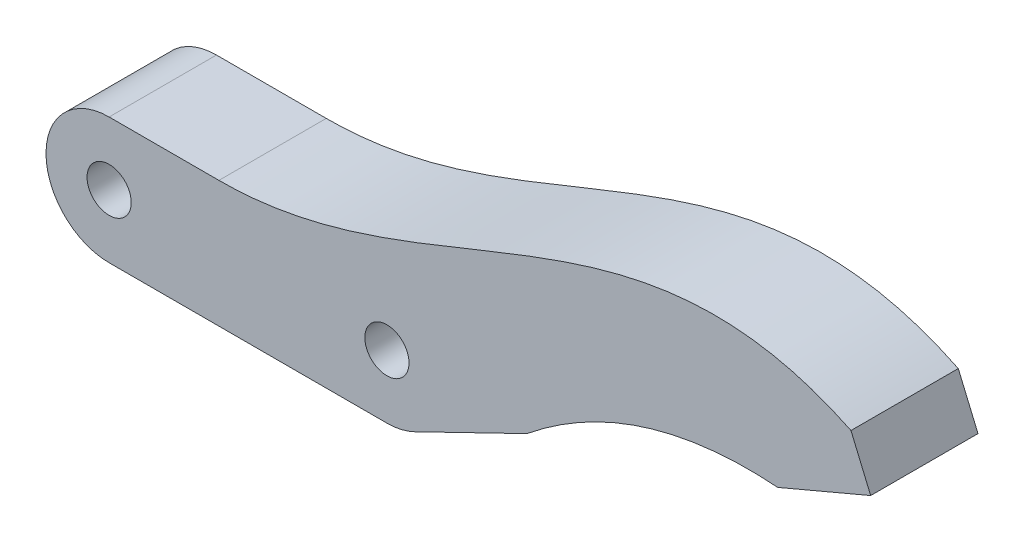
ISO-10303-21;
HEADER;
FILE_DESCRIPTION(('STEP AP214'),'2;1');
FILE_NAME('part.step','',(''),(''),'','','');
FILE_SCHEMA(('AUTOMOTIVE_DESIGN { 1 0 10303 214 1 1 1 1 }'));
ENDSEC;
DATA;
#1=APPLICATION_CONTEXT('core data for automotive mechanical design processes');
#2=APPLICATION_PROTOCOL_DEFINITION('international standard','automotive_design',2000,#1);
#3=PRODUCT_CONTEXT('',#1,'mechanical');
#4=PRODUCT('Part','Part','',(#3));
#5=PRODUCT_RELATED_PRODUCT_CATEGORY('part','',(#4));
#6=PRODUCT_DEFINITION_FORMATION('','',#4);
#7=PRODUCT_DEFINITION_CONTEXT('part definition',#1,'design');
#8=PRODUCT_DEFINITION('design','',#6,#7);
#9=PRODUCT_DEFINITION_SHAPE('','',#8);
#10=(LENGTH_UNIT() NAMED_UNIT(*) SI_UNIT(.MILLI.,.METRE.));
#11=(NAMED_UNIT(*) PLANE_ANGLE_UNIT() SI_UNIT($,.RADIAN.));
#12=(NAMED_UNIT(*) SI_UNIT($,.STERADIAN.) SOLID_ANGLE_UNIT());
#13=UNCERTAINTY_MEASURE_WITH_UNIT(LENGTH_MEASURE(1.E-05),#10,'distance_accuracy_value','');
#14=(GEOMETRIC_REPRESENTATION_CONTEXT(3) GLOBAL_UNCERTAINTY_ASSIGNED_CONTEXT((#13)) GLOBAL_UNIT_ASSIGNED_CONTEXT((#10,
#11,#12)) REPRESENTATION_CONTEXT('',''));
#15=CARTESIAN_POINT('',(0.,0.,0.));
#16=DIRECTION('',(0.,0.,1.));
#17=DIRECTION('',(1.,0.,0.));
#18=AXIS2_PLACEMENT_3D('',#15,#16,#17);
#19=CARTESIAN_POINT('',(27.,5.,4.25));
#20=DIRECTION('',(0.,0.,-1.));
#21=DIRECTION('',(-1.,0.,0.));
#22=AXIS2_PLACEMENT_3D('',#19,#20,#21);
#23=CYLINDRICAL_SURFACE('',#22,5.);
#24=DIRECTION('',(0.,0.,1.));
#25=VECTOR('',#24,1.);
#26=CARTESIAN_POINT('',(29.1838370751845,0.502127655318626,-4.25));
#27=LINE('',#26,#25);
#28=CARTESIAN_POINT('',(29.1838370751845,0.502127655318626,-4.25));
#29=VERTEX_POINT('',#28);
#30=CARTESIAN_POINT('',(29.1838370751845,0.502127655318626,4.25));
#31=VERTEX_POINT('',#30);
#32=EDGE_CURVE('E289',#29,#31,#27,.T.);
#33=ORIENTED_EDGE('',*,*,#32,.T.);
#34=CARTESIAN_POINT('',(27.,5.,4.25));
#35=DIRECTION('',(0.,0.,1.));
#36=DIRECTION('',(1.,0.,0.));
#37=AXIS2_PLACEMENT_3D('',#34,#35,#36);
#38=CIRCLE('',#37,5.);
#39=CARTESIAN_POINT('',(27.,0.,4.25));
#40=VERTEX_POINT('',#39);
#41=EDGE_CURVE('E236',#40,#31,#38,.T.);
#42=ORIENTED_EDGE('',*,*,#41,.F.);
#43=DIRECTION('',(0.,0.,-1.));
#44=VECTOR('',#43,1.);
#45=CARTESIAN_POINT('',(27.,0.,4.25));
#46=LINE('',#45,#44);
#47=CARTESIAN_POINT('',(27.,0.,-4.25));
#48=VERTEX_POINT('',#47);
#49=EDGE_CURVE('E57',#40,#48,#46,.T.);
#50=ORIENTED_EDGE('',*,*,#49,.T.);
#51=CARTESIAN_POINT('',(27.,5.,-4.25));
#52=DIRECTION('',(0.,0.,1.));
#53=DIRECTION('',(1.,0.,0.));
#54=AXIS2_PLACEMENT_3D('',#51,#52,#53);
#55=CIRCLE('',#54,5.);
#56=EDGE_CURVE('E210',#48,#29,#55,.T.);
#57=ORIENTED_EDGE('',*,*,#56,.T.);
#58=EDGE_LOOP('',(#33,#42,#50,#57));
#59=FACE_BOUND('',#58,.T.);
#60=ADVANCED_FACE('F47',(#59),#23,.T.);
#61=CARTESIAN_POINT('',(5.,5.,4.25));
#62=DIRECTION('',(0.,0.,-1.));
#63=DIRECTION('',(-1.,0.,0.));
#64=AXIS2_PLACEMENT_3D('',#61,#62,#63);
#65=CYLINDRICAL_SURFACE('',#64,5.);
#66=CARTESIAN_POINT('',(5.,5.,-4.25));
#67=DIRECTION('',(0.,0.,1.));
#68=DIRECTION('',(1.,0.,0.));
#69=AXIS2_PLACEMENT_3D('',#66,#67,#68);
#70=CIRCLE('',#69,5.);
#71=CARTESIAN_POINT('',(5.,10.,-4.25));
#72=VERTEX_POINT('',#71);
#73=CARTESIAN_POINT('',(5.,0.,-4.25));
#74=VERTEX_POINT('',#73);
#75=EDGE_CURVE('E202',#72,#74,#70,.T.);
#76=ORIENTED_EDGE('',*,*,#75,.T.);
#77=DIRECTION('',(0.,0.,-1.));
#78=VECTOR('',#77,1.);
#79=CARTESIAN_POINT('',(5.,0.,4.25));
#80=LINE('',#79,#78);
#81=CARTESIAN_POINT('',(5.,0.,4.25));
#82=VERTEX_POINT('',#81);
#83=EDGE_CURVE('E11',#82,#74,#80,.T.);
#84=ORIENTED_EDGE('',*,*,#83,.F.);
#85=CARTESIAN_POINT('',(5.,5.,4.25));
#86=DIRECTION('',(0.,0.,1.));
#87=DIRECTION('',(1.,0.,0.));
#88=AXIS2_PLACEMENT_3D('',#85,#86,#87);
#89=CIRCLE('',#88,5.);
#90=CARTESIAN_POINT('',(5.,10.,4.25));
#91=VERTEX_POINT('',#90);
#92=EDGE_CURVE('E297',#91,#82,#89,.T.);
#93=ORIENTED_EDGE('',*,*,#92,.F.);
#94=DIRECTION('',(0.,0.,-1.));
#95=VECTOR('',#94,1.);
#96=CARTESIAN_POINT('',(5.,10.,4.25));
#97=LINE('',#96,#95);
#98=EDGE_CURVE('E65',#91,#72,#97,.T.);
#99=ORIENTED_EDGE('',*,*,#98,.T.);
#100=EDGE_LOOP('',(#76,#84,#93,#99));
#101=FACE_BOUND('',#100,.T.);
#102=ADVANCED_FACE('F196',(#101),#65,.T.);
#103=CARTESIAN_POINT('',(0.,0.,4.25));
#104=DIRECTION('',(0.,1.,0.));
#105=DIRECTION('',(0.,0.,1.));
#106=AXIS2_PLACEMENT_3D('',#103,#104,#105);
#107=PLANE('',#106);
#108=DIRECTION('',(1.,0.,0.));
#109=VECTOR('',#108,1.);
#110=CARTESIAN_POINT('',(0.,0.,-4.25));
#111=LINE('',#110,#109);
#112=EDGE_CURVE('E79',#74,#48,#111,.T.);
#113=ORIENTED_EDGE('',*,*,#112,.T.);
#114=ORIENTED_EDGE('',*,*,#49,.F.);
#115=DIRECTION('',(1.,0.,0.));
#116=VECTOR('',#115,1.);
#117=CARTESIAN_POINT('',(0.,0.,4.25));
#118=LINE('',#117,#116);
#119=EDGE_CURVE('E85',#82,#40,#118,.T.);
#120=ORIENTED_EDGE('',*,*,#119,.F.);
#121=ORIENTED_EDGE('',*,*,#83,.T.);
#122=EDGE_LOOP('',(#113,#114,#120,#121));
#123=FACE_BOUND('',#122,.T.);
#124=ADVANCED_FACE('F193',(#123),#107,.F.);
#125=CARTESIAN_POINT('',(0.,10.,4.25));
#126=DIRECTION('',(0.,1.,0.));
#127=DIRECTION('',(0.,0.,1.));
#128=AXIS2_PLACEMENT_3D('',#125,#126,#127);
#129=PLANE('',#128);
#130=DIRECTION('',(0.,0.,1.));
#131=VECTOR('',#130,1.);
#132=CARTESIAN_POINT('',(13.69497476,10.,-4.25));
#133=LINE('',#132,#131);
#134=CARTESIAN_POINT('',(13.69497476,10.,-4.25));
#135=VERTEX_POINT('',#134);
#136=CARTESIAN_POINT('',(13.69497476,10.,4.25));
#137=VERTEX_POINT('',#136);
#138=EDGE_CURVE('E136',#135,#137,#133,.T.);
#139=ORIENTED_EDGE('',*,*,#138,.F.);
#140=DIRECTION('',(1.,0.,0.));
#141=VECTOR('',#140,1.);
#142=CARTESIAN_POINT('',(0.,10.,-4.25));
#143=LINE('',#142,#141);
#144=EDGE_CURVE('E147',#72,#135,#143,.T.);
#145=ORIENTED_EDGE('',*,*,#144,.F.);
#146=ORIENTED_EDGE('',*,*,#98,.F.);
#147=DIRECTION('',(1.,0.,0.));
#148=VECTOR('',#147,1.);
#149=CARTESIAN_POINT('',(0.,10.,4.25));
#150=LINE('',#149,#148);
#151=EDGE_CURVE('E302',#91,#137,#150,.T.);
#152=ORIENTED_EDGE('',*,*,#151,.T.);
#153=EDGE_LOOP('',(#139,#145,#146,#152));
#154=FACE_BOUND('',#153,.T.);
#155=ADVANCED_FACE('F190',(#154),#129,.T.);
#156=CARTESIAN_POINT('',(5.,5.,4.25));
#157=DIRECTION('',(0.,0.,-1.));
#158=DIRECTION('',(-1.,0.,0.));
#159=AXIS2_PLACEMENT_3D('',#156,#157,#158);
#160=CYLINDRICAL_SURFACE('',#159,1.75);
#161=CARTESIAN_POINT('',(5.,5.,4.25));
#162=DIRECTION('',(0.,0.,1.));
#163=DIRECTION('',(1.,0.,0.));
#164=AXIS2_PLACEMENT_3D('',#161,#162,#163);
#165=CIRCLE('',#164,1.75);
#166=CARTESIAN_POINT('',(6.75,5.,4.25));
#167=VERTEX_POINT('',#166);
#168=EDGE_CURVE('E226',#167,#167,#165,.T.);
#169=ORIENTED_EDGE('',*,*,#168,.T.);
#170=EDGE_LOOP('',(#169));
#171=FACE_BOUND('',#170,.T.);
#172=CARTESIAN_POINT('',(5.,5.,-4.25));
#173=DIRECTION('',(0.,0.,1.));
#174=DIRECTION('',(1.,0.,0.));
#175=AXIS2_PLACEMENT_3D('',#172,#173,#174);
#176=CIRCLE('',#175,1.75);
#177=CARTESIAN_POINT('',(6.75,5.,-4.25));
#178=VERTEX_POINT('',#177);
#179=EDGE_CURVE('E204',#178,#178,#176,.T.);
#180=ORIENTED_EDGE('',*,*,#179,.F.);
#181=EDGE_LOOP('',(#180));
#182=FACE_BOUND('',#181,.T.);
#183=ADVANCED_FACE('F49',(#171,#182),#160,.F.);
#184=CARTESIAN_POINT('',(27.,5.,4.25));
#185=DIRECTION('',(0.,0.,-1.));
#186=DIRECTION('',(-1.,0.,0.));
#187=AXIS2_PLACEMENT_3D('',#184,#185,#186);
#188=CYLINDRICAL_SURFACE('',#187,1.75);
#189=CARTESIAN_POINT('',(27.,5.,4.25));
#190=DIRECTION('',(0.,0.,1.));
#191=DIRECTION('',(1.,0.,0.));
#192=AXIS2_PLACEMENT_3D('',#189,#190,#191);
#193=CIRCLE('',#192,1.75);
#194=CARTESIAN_POINT('',(28.75,5.,4.25));
#195=VERTEX_POINT('',#194);
#196=EDGE_CURVE('E228',#195,#195,#193,.T.);
#197=ORIENTED_EDGE('',*,*,#196,.T.);
#198=EDGE_LOOP('',(#197));
#199=FACE_BOUND('',#198,.T.);
#200=CARTESIAN_POINT('',(27.,5.,-4.25));
#201=DIRECTION('',(0.,0.,1.));
#202=DIRECTION('',(1.,0.,0.));
#203=AXIS2_PLACEMENT_3D('',#200,#201,#202);
#204=CIRCLE('',#203,1.75);
#205=CARTESIAN_POINT('',(28.75,5.,-4.25));
#206=VERTEX_POINT('',#205);
#207=EDGE_CURVE('E222',#206,#206,#204,.T.);
#208=ORIENTED_EDGE('',*,*,#207,.F.);
#209=EDGE_LOOP('',(#208));
#210=FACE_BOUND('',#209,.T.);
#211=ADVANCED_FACE('F182',(#199,#210),#188,.F.);
#212=CARTESIAN_POINT('',(0.,0.,4.25));
#213=DIRECTION('',(0.,0.,1.));
#214=DIRECTION('',(1.,0.,0.));
#215=AXIS2_PLACEMENT_3D('',#212,#213,#214);
#216=PLANE('',#215);
#217=ORIENTED_EDGE('',*,*,#168,.F.);
#218=EDGE_LOOP('',(#217));
#219=FACE_BOUND('',#218,.T.);
#220=ORIENTED_EDGE('',*,*,#92,.T.);
#221=ORIENTED_EDGE('',*,*,#119,.T.);
#222=ORIENTED_EDGE('',*,*,#41,.T.);
#223=DIRECTION('',(0.899574468936274,0.436767415036906,0.));
#224=VECTOR('',#223,1.);
#225=CARTESIAN_POINT('',(5.36998891865862,-11.0601312354948,4.25));
#226=LINE('',#225,#224);
#227=CARTESIAN_POINT('',(38.0854206612254,4.82408407678908,4.25));
#228=VERTEX_POINT('',#227);
#229=EDGE_CURVE('E273',#31,#228,#226,.T.);
#230=ORIENTED_EDGE('',*,*,#229,.T.);
#231=CARTESIAN_POINT('',(38.0854206612254,4.82408407678908,4.25));
#232=CARTESIAN_POINT('',(46.797509510781,11.8952224566425,4.25));
#233=CARTESIAN_POINT('',(57.9480004100139,11.0678436667493,4.25));
#234=B_SPLINE_CURVE_WITH_KNOTS('',2,(#231,#232,#233),.UNSPECIFIED.,.F.,.F.,(3,3),(0.,1.),.UNSPECIFIED.);
#235=CARTESIAN_POINT('',(57.9480004100139,11.0678436667493,4.25));
#236=VERTEX_POINT('',#235);
#237=EDGE_CURVE('E160',#228,#236,#234,.T.);
#238=ORIENTED_EDGE('',*,*,#237,.T.);
#239=DIRECTION('',(0.920726160293631,0.39020935118337,0.));
#240=VECTOR('',#239,1.);
#241=CARTESIAN_POINT('',(4.84694582619869,-11.4367064914598,4.25));
#242=LINE('',#241,#240);
#243=CARTESIAN_POINT('',(65.3138096923629,14.1895184762162,4.25));
#244=VERTEX_POINT('',#243);
#245=EDGE_CURVE('E154',#236,#244,#242,.T.);
#246=ORIENTED_EDGE('',*,*,#245,.T.);
#247=DIRECTION('',(-0.39020935118337,0.920726160293631,0.));
#248=VECTOR('',#247,1.);
#249=CARTESIAN_POINT('',(60.4668638661642,25.626224967676,4.25));
#250=LINE('',#249,#248);
#251=CARTESIAN_POINT('',(63.7529722876294,17.8724231173908,4.25));
#252=VERTEX_POINT('',#251);
#253=EDGE_CURVE('E270',#244,#252,#250,.T.);
#254=ORIENTED_EDGE('',*,*,#253,.T.);
#255=CARTESIAN_POINT('',(63.7529722876294,17.8724231173908,4.25));
#256=CARTESIAN_POINT('',(45.928882679272,26.5637879626771,4.25));
#257=CARTESIAN_POINT('',(31.0592686220212,10.,4.25));
#258=CARTESIAN_POINT('',(13.69497476,10.,4.25));
#259=B_SPLINE_CURVE_WITH_KNOTS('',3,(#255,#256,#257,#258),.UNSPECIFIED.,.F.,.F.,(4,4),(0.,1.),.UNSPECIFIED.);
#260=EDGE_CURVE('E130',#252,#137,#259,.T.);
#261=ORIENTED_EDGE('',*,*,#260,.T.);
#262=ORIENTED_EDGE('',*,*,#151,.F.);
#263=EDGE_LOOP('',(#220,#221,#222,#230,#238,#246,#254,#261,#262));
#264=FACE_BOUND('',#263,.T.);
#265=ORIENTED_EDGE('',*,*,#196,.F.);
#266=EDGE_LOOP('',(#265));
#267=FACE_BOUND('',#266,.T.);
#268=ADVANCED_FACE('F179',(#219,#264,#267),#216,.T.);
#269=CARTESIAN_POINT('',(0.,0.,-4.25));
#270=DIRECTION('',(0.,0.,1.));
#271=DIRECTION('',(1.,0.,0.));
#272=AXIS2_PLACEMENT_3D('',#269,#270,#271);
#273=PLANE('',#272);
#274=ORIENTED_EDGE('',*,*,#179,.T.);
#275=EDGE_LOOP('',(#274));
#276=FACE_BOUND('',#275,.T.);
#277=ORIENTED_EDGE('',*,*,#75,.F.);
#278=ORIENTED_EDGE('',*,*,#144,.T.);
#279=CARTESIAN_POINT('',(63.7529722876294,17.8724231173908,-4.25));
#280=CARTESIAN_POINT('',(45.928882679272,26.5637879626771,-4.25));
#281=CARTESIAN_POINT('',(31.0592686220212,10.,-4.25));
#282=CARTESIAN_POINT('',(13.69497476,10.,-4.25));
#283=B_SPLINE_CURVE_WITH_KNOTS('',3,(#279,#280,#281,#282),.UNSPECIFIED.,.F.,.F.,(4,4),(0.,1.),.UNSPECIFIED.);
#284=CARTESIAN_POINT('',(63.7529722876294,17.8724231173908,-4.25));
#285=VERTEX_POINT('',#284);
#286=EDGE_CURVE('E127',#285,#135,#283,.T.);
#287=ORIENTED_EDGE('',*,*,#286,.F.);
#288=DIRECTION('',(-0.39020935118337,0.920726160293631,0.));
#289=VECTOR('',#288,1.);
#290=CARTESIAN_POINT('',(60.4668638661642,25.626224967676,-4.25));
#291=LINE('',#290,#289);
#292=CARTESIAN_POINT('',(65.3138096923629,14.1895184762162,-4.25));
#293=VERTEX_POINT('',#292);
#294=EDGE_CURVE('E145',#293,#285,#291,.T.);
#295=ORIENTED_EDGE('',*,*,#294,.F.);
#296=DIRECTION('',(0.920726160293631,0.39020935118337,0.));
#297=VECTOR('',#296,1.);
#298=CARTESIAN_POINT('',(4.84694582619869,-11.4367064914598,-4.25));
#299=LINE('',#298,#297);
#300=CARTESIAN_POINT('',(57.9480004100139,11.0678436667493,-4.25));
#301=VERTEX_POINT('',#300);
#302=EDGE_CURVE('E137',#301,#293,#299,.T.);
#303=ORIENTED_EDGE('',*,*,#302,.F.);
#304=CARTESIAN_POINT('',(38.0854206612254,4.82408407678908,-4.25));
#305=CARTESIAN_POINT('',(46.797509510781,11.8952224566425,-4.25));
#306=CARTESIAN_POINT('',(57.9480004100139,11.0678436667493,-4.25));
#307=B_SPLINE_CURVE_WITH_KNOTS('',2,(#304,#305,#306),.UNSPECIFIED.,.F.,.F.,(3,3),(0.,1.),.UNSPECIFIED.);
#308=CARTESIAN_POINT('',(38.0854206612254,4.82408407678908,-4.25));
#309=VERTEX_POINT('',#308);
#310=EDGE_CURVE('E241',#309,#301,#307,.T.);
#311=ORIENTED_EDGE('',*,*,#310,.F.);
#312=DIRECTION('',(0.899574468936274,0.436767415036906,0.));
#313=VECTOR('',#312,1.);
#314=CARTESIAN_POINT('',(5.36998891865862,-11.0601312354948,-4.25));
#315=LINE('',#314,#313);
#316=EDGE_CURVE('E149',#29,#309,#315,.T.);
#317=ORIENTED_EDGE('',*,*,#316,.F.);
#318=ORIENTED_EDGE('',*,*,#56,.F.);
#319=ORIENTED_EDGE('',*,*,#112,.F.);
#320=EDGE_LOOP('',(#277,#278,#287,#295,#303,#311,#317,#318,#319));
#321=FACE_BOUND('',#320,.T.);
#322=ORIENTED_EDGE('',*,*,#207,.T.);
#323=EDGE_LOOP('',(#322));
#324=FACE_BOUND('',#323,.T.);
#325=ADVANCED_FACE('F142',(#276,#321,#324),#273,.F.);
#326=CARTESIAN_POINT('',(60.4668638661642,25.626224967676,-4.25));
#327=DIRECTION('',(0.920726160293631,0.39020935118337,0.));
#328=DIRECTION('',(-0.39020935118337,0.920726160293631,0.));
#329=AXIS2_PLACEMENT_3D('',#326,#327,#328);
#330=PLANE('',#329);
#331=ORIENTED_EDGE('',*,*,#253,.F.);
#332=DIRECTION('',(0.,0.,1.));
#333=VECTOR('',#332,1.);
#334=CARTESIAN_POINT('',(65.3138096923629,14.1895184762162,-4.25));
#335=LINE('',#334,#333);
#336=EDGE_CURVE('E152',#293,#244,#335,.T.);
#337=ORIENTED_EDGE('',*,*,#336,.F.);
#338=ORIENTED_EDGE('',*,*,#294,.T.);
#339=DIRECTION('',(0.,0.,1.));
#340=VECTOR('',#339,1.);
#341=CARTESIAN_POINT('',(63.7529722876294,17.8724231173908,-4.25));
#342=LINE('',#341,#340);
#343=EDGE_CURVE('E124',#285,#252,#342,.T.);
#344=ORIENTED_EDGE('',*,*,#343,.T.);
#345=EDGE_LOOP('',(#331,#337,#338,#344));
#346=FACE_BOUND('',#345,.T.);
#347=ADVANCED_FACE('F151',(#346),#330,.T.);
#348=CARTESIAN_POINT('',(4.84694582619869,-11.4367064914598,-4.25));
#349=DIRECTION('',(0.39020935118337,-0.920726160293631,0.));
#350=DIRECTION('',(0.920726160293631,0.39020935118337,0.));
#351=AXIS2_PLACEMENT_3D('',#348,#349,#350);
#352=PLANE('',#351);
#353=ORIENTED_EDGE('',*,*,#245,.F.);
#354=DIRECTION('',(0.,0.,1.));
#355=VECTOR('',#354,1.);
#356=CARTESIAN_POINT('',(57.9480004100139,11.0678436667493,-4.25));
#357=LINE('',#356,#355);
#358=EDGE_CURVE('E266',#301,#236,#357,.T.);
#359=ORIENTED_EDGE('',*,*,#358,.F.);
#360=ORIENTED_EDGE('',*,*,#302,.T.);
#361=ORIENTED_EDGE('',*,*,#336,.T.);
#362=EDGE_LOOP('',(#353,#359,#360,#361));
#363=FACE_BOUND('',#362,.T.);
#364=ADVANCED_FACE('F178',(#363),#352,.T.);
#365=DIRECTION('',(0.,0.,1.));
#366=VECTOR('',#365,1.);
#367=SURFACE_OF_LINEAR_EXTRUSION('',#307,#366);
#368=ORIENTED_EDGE('',*,*,#237,.F.);
#369=DIRECTION('',(0.,0.,1.));
#370=VECTOR('',#369,1.);
#371=CARTESIAN_POINT('',(38.0854206612254,4.82408407678908,-4.25));
#372=LINE('',#371,#370);
#373=EDGE_CURVE('E286',#309,#228,#372,.T.);
#374=ORIENTED_EDGE('',*,*,#373,.F.);
#375=ORIENTED_EDGE('',*,*,#310,.T.);
#376=ORIENTED_EDGE('',*,*,#358,.T.);
#377=EDGE_LOOP('',(#368,#374,#375,#376));
#378=FACE_BOUND('',#377,.T.);
#379=ADVANCED_FACE('F259',(#378),#367,.T.);
#380=CARTESIAN_POINT('',(5.36998891865862,-11.0601312354948,-4.25));
#381=DIRECTION('',(0.436767415036906,-0.899574468936274,0.));
#382=DIRECTION('',(0.899574468936274,0.436767415036906,0.));
#383=AXIS2_PLACEMENT_3D('',#380,#381,#382);
#384=PLANE('',#383);
#385=ORIENTED_EDGE('',*,*,#229,.F.);
#386=ORIENTED_EDGE('',*,*,#32,.F.);
#387=ORIENTED_EDGE('',*,*,#316,.T.);
#388=ORIENTED_EDGE('',*,*,#373,.T.);
#389=EDGE_LOOP('',(#385,#386,#387,#388));
#390=FACE_BOUND('',#389,.T.);
#391=ADVANCED_FACE('F174',(#390),#384,.T.);
#392=DIRECTION('',(0.,0.,1.));
#393=VECTOR('',#392,1.);
#394=SURFACE_OF_LINEAR_EXTRUSION('',#283,#393);
#395=ORIENTED_EDGE('',*,*,#260,.F.);
#396=ORIENTED_EDGE('',*,*,#343,.F.);
#397=ORIENTED_EDGE('',*,*,#286,.T.);
#398=ORIENTED_EDGE('',*,*,#138,.T.);
#399=EDGE_LOOP('',(#395,#396,#397,#398));
#400=FACE_BOUND('',#399,.T.);
#401=ADVANCED_FACE('F126',(#400),#394,.T.);
#402=CLOSED_SHELL('',(#60,#102,#124,#155,#183,#211,#268,#325,#347,#364,#379,#391,#401));
#403=MANIFOLD_SOLID_BREP('B2',#402);
#404=ADVANCED_BREP_SHAPE_REPRESENTATION('',(#18,#403),#14);
#405=SHAPE_DEFINITION_REPRESENTATION(#9,#404);
ENDSEC;
END-ISO-10303-21;
